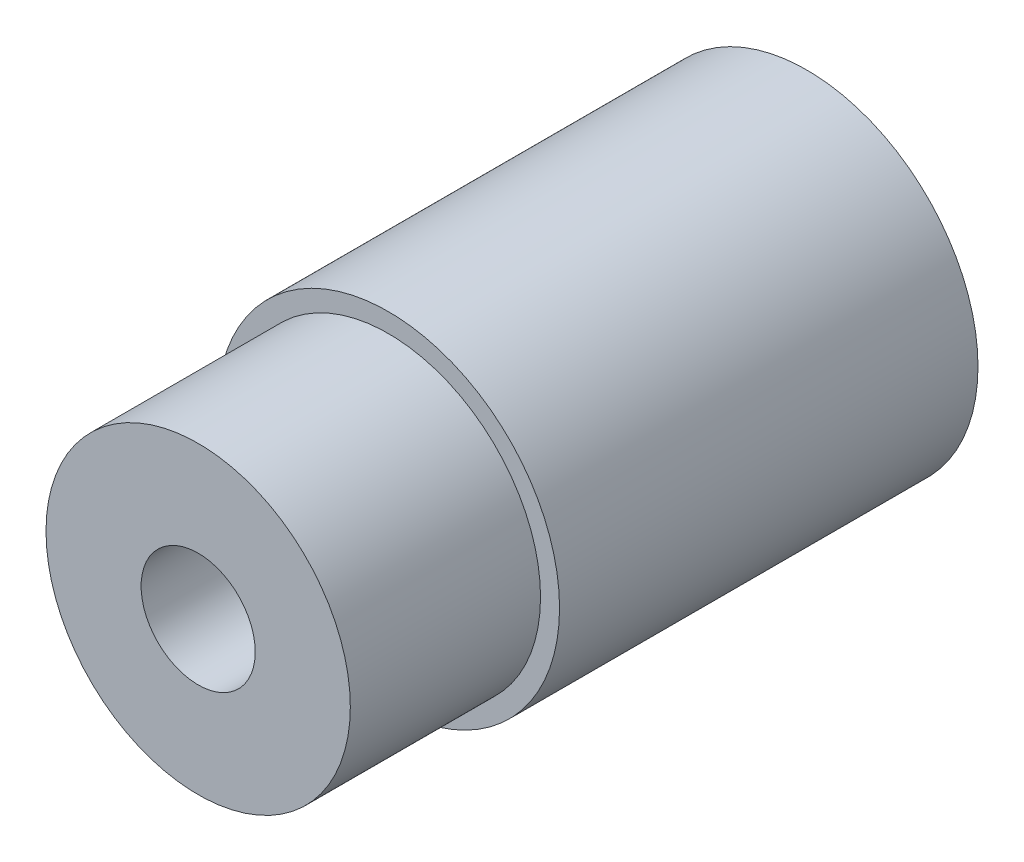
ISO-10303-21;
HEADER;
FILE_DESCRIPTION(('STEP AP214'),'2;1');
FILE_NAME('part.step','',(''),(''),'','','');
FILE_SCHEMA(('AUTOMOTIVE_DESIGN { 1 0 10303 214 1 1 1 1 }'));
ENDSEC;
DATA;
#1=APPLICATION_CONTEXT('core data for automotive mechanical design processes');
#2=APPLICATION_PROTOCOL_DEFINITION('international standard','automotive_design',2000,#1);
#3=PRODUCT_CONTEXT('',#1,'mechanical');
#4=PRODUCT('Part','Part','',(#3));
#5=PRODUCT_RELATED_PRODUCT_CATEGORY('part','',(#4));
#6=PRODUCT_DEFINITION_FORMATION('','',#4);
#7=PRODUCT_DEFINITION_CONTEXT('part definition',#1,'design');
#8=PRODUCT_DEFINITION('design','',#6,#7);
#9=PRODUCT_DEFINITION_SHAPE('','',#8);
#10=(LENGTH_UNIT() NAMED_UNIT(*) SI_UNIT(.MILLI.,.METRE.));
#11=(NAMED_UNIT(*) PLANE_ANGLE_UNIT() SI_UNIT($,.RADIAN.));
#12=(NAMED_UNIT(*) SI_UNIT($,.STERADIAN.) SOLID_ANGLE_UNIT());
#13=UNCERTAINTY_MEASURE_WITH_UNIT(LENGTH_MEASURE(1.E-05),#10,'distance_accuracy_value','');
#14=(GEOMETRIC_REPRESENTATION_CONTEXT(3) GLOBAL_UNCERTAINTY_ASSIGNED_CONTEXT((#13)) GLOBAL_UNIT_ASSIGNED_CONTEXT((#10,
#11,#12)) REPRESENTATION_CONTEXT('',''));
#15=CARTESIAN_POINT('',(0.,0.,0.));
#16=DIRECTION('',(0.,0.,1.));
#17=DIRECTION('',(1.,0.,0.));
#18=AXIS2_PLACEMENT_3D('',#15,#16,#17);
#19=CARTESIAN_POINT('',(0.,0.,32.));
#20=DIRECTION('',(0.,0.,-1.));
#21=DIRECTION('',(-1.,0.,0.));
#22=AXIS2_PLACEMENT_3D('',#19,#20,#21);
#23=CYLINDRICAL_SURFACE('',#22,8.);
#24=CARTESIAN_POINT('',(0.,0.,32.));
#25=DIRECTION('',(0.,0.,1.));
#26=DIRECTION('',(1.,0.,0.));
#27=AXIS2_PLACEMENT_3D('',#24,#25,#26);
#28=CIRCLE('',#27,8.);
#29=CARTESIAN_POINT('',(8.,0.,32.));
#30=VERTEX_POINT('',#29);
#31=EDGE_CURVE('E50',#30,#30,#28,.T.);
#32=ORIENTED_EDGE('',*,*,#31,.F.);
#33=EDGE_LOOP('',(#32));
#34=FACE_BOUND('',#33,.T.);
#35=CARTESIAN_POINT('',(0.,0.,22.));
#36=DIRECTION('',(0.,0.,-1.));
#37=DIRECTION('',(-1.,0.,0.));
#38=AXIS2_PLACEMENT_3D('',#35,#36,#37);
#39=CIRCLE('',#38,8.);
#40=CARTESIAN_POINT('',(-8.,0.,22.));
#41=VERTEX_POINT('',#40);
#42=EDGE_CURVE('E10',#41,#41,#39,.T.);
#43=ORIENTED_EDGE('',*,*,#42,.F.);
#44=EDGE_LOOP('',(#43));
#45=FACE_BOUND('',#44,.T.);
#46=ADVANCED_FACE('F43',(#34,#45),#23,.T.);
#47=CARTESIAN_POINT('',(0.,0.,32.));
#48=DIRECTION('',(0.,0.,1.));
#49=DIRECTION('',(1.,0.,0.));
#50=AXIS2_PLACEMENT_3D('',#47,#48,#49);
#51=PLANE('',#50);
#52=CARTESIAN_POINT('',(0.,0.,32.));
#53=DIRECTION('',(0.,0.,1.));
#54=DIRECTION('',(1.,0.,0.));
#55=AXIS2_PLACEMENT_3D('',#52,#53,#54);
#56=CIRCLE('',#55,3.);
#57=CARTESIAN_POINT('',(3.,0.,32.));
#58=VERTEX_POINT('',#57);
#59=EDGE_CURVE('E70',#58,#58,#56,.T.);
#60=ORIENTED_EDGE('',*,*,#59,.F.);
#61=EDGE_LOOP('',(#60));
#62=FACE_BOUND('',#61,.T.);
#63=ORIENTED_EDGE('',*,*,#31,.T.);
#64=EDGE_LOOP('',(#63));
#65=FACE_BOUND('',#64,.T.);
#66=ADVANCED_FACE('F78',(#62,#65),#51,.T.);
#67=CARTESIAN_POINT('',(0.,0.,22.));
#68=DIRECTION('',(0.,0.,-1.));
#69=DIRECTION('',(-1.,0.,0.));
#70=AXIS2_PLACEMENT_3D('',#67,#68,#69);
#71=CYLINDRICAL_SURFACE('',#70,9.);
#72=CARTESIAN_POINT('',(0.,0.,22.));
#73=DIRECTION('',(0.,0.,-1.));
#74=DIRECTION('',(-1.,0.,0.));
#75=AXIS2_PLACEMENT_3D('',#72,#73,#74);
#76=CIRCLE('',#75,9.);
#77=CARTESIAN_POINT('',(-9.,0.,22.));
#78=VERTEX_POINT('',#77);
#79=EDGE_CURVE('E55',#78,#78,#76,.T.);
#80=ORIENTED_EDGE('',*,*,#79,.T.);
#81=EDGE_LOOP('',(#80));
#82=FACE_BOUND('',#81,.T.);
#83=CARTESIAN_POINT('',(0.,0.,0.));
#84=DIRECTION('',(0.,0.,-1.));
#85=DIRECTION('',(-1.,0.,0.));
#86=AXIS2_PLACEMENT_3D('',#83,#84,#85);
#87=CIRCLE('',#86,9.);
#88=CARTESIAN_POINT('',(-9.,0.,0.));
#89=VERTEX_POINT('',#88);
#90=EDGE_CURVE('E60',#89,#89,#87,.T.);
#91=ORIENTED_EDGE('',*,*,#90,.F.);
#92=EDGE_LOOP('',(#91));
#93=FACE_BOUND('',#92,.T.);
#94=ADVANCED_FACE('F80',(#82,#93),#71,.T.);
#95=CARTESIAN_POINT('',(0.,0.,22.));
#96=DIRECTION('',(0.,0.,-1.));
#97=DIRECTION('',(-1.,0.,0.));
#98=AXIS2_PLACEMENT_3D('',#95,#96,#97);
#99=PLANE('',#98);
#100=ORIENTED_EDGE('',*,*,#42,.T.);
#101=EDGE_LOOP('',(#100));
#102=FACE_BOUND('',#101,.T.);
#103=ORIENTED_EDGE('',*,*,#79,.F.);
#104=EDGE_LOOP('',(#103));
#105=FACE_BOUND('',#104,.T.);
#106=ADVANCED_FACE('F86',(#102,#105),#99,.F.);
#107=CARTESIAN_POINT('',(0.,0.,0.));
#108=DIRECTION('',(0.,0.,1.));
#109=DIRECTION('',(1.,0.,0.));
#110=AXIS2_PLACEMENT_3D('',#107,#108,#109);
#111=PLANE('',#110);
#112=CARTESIAN_POINT('',(0.,0.,0.));
#113=DIRECTION('',(0.,0.,1.));
#114=DIRECTION('',(1.,0.,0.));
#115=AXIS2_PLACEMENT_3D('',#112,#113,#114);
#116=CIRCLE('',#115,3.);
#117=CARTESIAN_POINT('',(3.,0.,0.));
#118=VERTEX_POINT('',#117);
#119=EDGE_CURVE('E65',#118,#118,#116,.F.);
#120=ORIENTED_EDGE('',*,*,#119,.F.);
#121=EDGE_LOOP('',(#120));
#122=FACE_BOUND('',#121,.T.);
#123=ORIENTED_EDGE('',*,*,#90,.T.);
#124=EDGE_LOOP('',(#123));
#125=FACE_BOUND('',#124,.T.);
#126=ADVANCED_FACE('F91',(#122,#125),#111,.F.);
#127=CARTESIAN_POINT('',(0.,0.,-0.001000000000001));
#128=DIRECTION('',(0.,0.,1.));
#129=DIRECTION('',(1.,0.,0.));
#130=AXIS2_PLACEMENT_3D('',#127,#128,#129);
#131=CYLINDRICAL_SURFACE('',#130,3.);
#132=ORIENTED_EDGE('',*,*,#59,.T.);
#133=EDGE_LOOP('',(#132));
#134=FACE_BOUND('',#133,.T.);
#135=ORIENTED_EDGE('',*,*,#119,.T.);
#136=EDGE_LOOP('',(#135));
#137=FACE_BOUND('',#136,.T.);
#138=ADVANCED_FACE('F75',(#134,#137),#131,.F.);
#139=CLOSED_SHELL('',(#46,#66,#94,#106,#126,#138));
#140=MANIFOLD_SOLID_BREP('B2',#139);
#141=ADVANCED_BREP_SHAPE_REPRESENTATION('',(#18,#140),#14);
#142=SHAPE_DEFINITION_REPRESENTATION(#9,#141);
ENDSEC;
END-ISO-10303-21;
